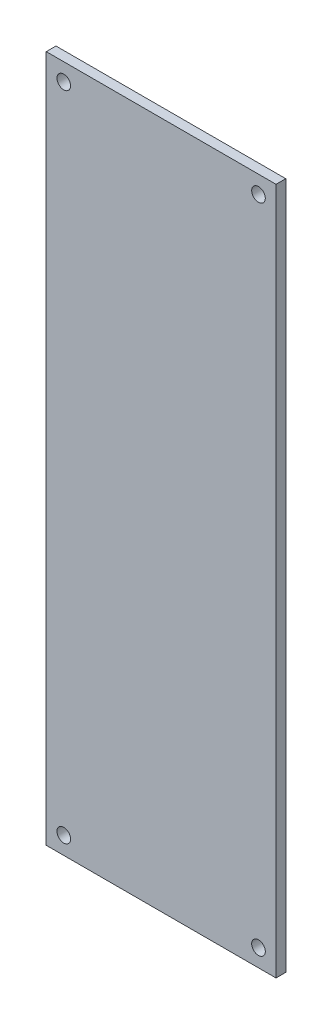
ISO-10303-21;
HEADER;
FILE_DESCRIPTION(('STEP AP214'),'2;1');
FILE_NAME('part.step','',(''),(''),'','','');
FILE_SCHEMA(('AUTOMOTIVE_DESIGN { 1 0 10303 214 1 1 1 1 }'));
ENDSEC;
DATA;
#1=APPLICATION_CONTEXT('core data for automotive mechanical design processes');
#2=APPLICATION_PROTOCOL_DEFINITION('international standard','automotive_design',2000,#1);
#3=PRODUCT_CONTEXT('',#1,'mechanical');
#4=PRODUCT('Part','Part','',(#3));
#5=PRODUCT_RELATED_PRODUCT_CATEGORY('part','',(#4));
#6=PRODUCT_DEFINITION_FORMATION('','',#4);
#7=PRODUCT_DEFINITION_CONTEXT('part definition',#1,'design');
#8=PRODUCT_DEFINITION('design','',#6,#7);
#9=PRODUCT_DEFINITION_SHAPE('','',#8);
#10=(LENGTH_UNIT() NAMED_UNIT(*) SI_UNIT(.MILLI.,.METRE.));
#11=(NAMED_UNIT(*) PLANE_ANGLE_UNIT() SI_UNIT($,.RADIAN.));
#12=(NAMED_UNIT(*) SI_UNIT($,.STERADIAN.) SOLID_ANGLE_UNIT());
#13=UNCERTAINTY_MEASURE_WITH_UNIT(LENGTH_MEASURE(1.E-05),#10,'distance_accuracy_value','');
#14=(GEOMETRIC_REPRESENTATION_CONTEXT(3) GLOBAL_UNCERTAINTY_ASSIGNED_CONTEXT((#13)) GLOBAL_UNIT_ASSIGNED_CONTEXT((#10,
#11,#12)) REPRESENTATION_CONTEXT('',''));
#15=CARTESIAN_POINT('',(0.,0.,0.));
#16=DIRECTION('',(0.,0.,1.));
#17=DIRECTION('',(1.,0.,0.));
#18=AXIS2_PLACEMENT_3D('',#15,#16,#17);
#19=CARTESIAN_POINT('',(59.,-176.5,5.));
#20=DIRECTION('',(-1.,0.,0.));
#21=DIRECTION('',(0.,0.,1.));
#22=AXIS2_PLACEMENT_3D('',#19,#20,#21);
#23=PLANE('',#22);
#24=DIRECTION('',(0.,1.,0.));
#25=VECTOR('',#24,1.);
#26=CARTESIAN_POINT('',(59.,-176.5,0.));
#27=LINE('',#26,#25);
#28=CARTESIAN_POINT('',(59.,-176.5,0.));
#29=VERTEX_POINT('',#28);
#30=CARTESIAN_POINT('',(59.,176.5,0.));
#31=VERTEX_POINT('',#30);
#32=EDGE_CURVE('E102',#29,#31,#27,.T.);
#33=ORIENTED_EDGE('',*,*,#32,.T.);
#34=DIRECTION('',(0.,0.,-1.));
#35=VECTOR('',#34,1.);
#36=CARTESIAN_POINT('',(59.,176.5,5.));
#37=LINE('',#36,#35);
#38=CARTESIAN_POINT('',(59.,176.5,5.));
#39=VERTEX_POINT('',#38);
#40=EDGE_CURVE('E11',#39,#31,#37,.T.);
#41=ORIENTED_EDGE('',*,*,#40,.F.);
#42=DIRECTION('',(0.,1.,0.));
#43=VECTOR('',#42,1.);
#44=CARTESIAN_POINT('',(59.,-176.5,5.));
#45=LINE('',#44,#43);
#46=CARTESIAN_POINT('',(59.,-176.5,5.));
#47=VERTEX_POINT('',#46);
#48=EDGE_CURVE('E90',#47,#39,#45,.T.);
#49=ORIENTED_EDGE('',*,*,#48,.F.);
#50=DIRECTION('',(0.,0.,-1.));
#51=VECTOR('',#50,1.);
#52=CARTESIAN_POINT('',(59.,-176.5,5.));
#53=LINE('',#52,#51);
#54=EDGE_CURVE('E98',#47,#29,#53,.T.);
#55=ORIENTED_EDGE('',*,*,#54,.T.);
#56=EDGE_LOOP('',(#33,#41,#49,#55));
#57=FACE_BOUND('',#56,.T.);
#58=ADVANCED_FACE('F39',(#57),#23,.F.);
#59=CARTESIAN_POINT('',(-59.,176.5,5.));
#60=DIRECTION('',(0.,-1.,0.));
#61=DIRECTION('',(0.,0.,-1.));
#62=AXIS2_PLACEMENT_3D('',#59,#60,#61);
#63=PLANE('',#62);
#64=DIRECTION('',(-1.,0.,0.));
#65=VECTOR('',#64,1.);
#66=CARTESIAN_POINT('',(-59.,176.5,0.));
#67=LINE('',#66,#65);
#68=CARTESIAN_POINT('',(-59.,176.5,0.));
#69=VERTEX_POINT('',#68);
#70=EDGE_CURVE('E94',#31,#69,#67,.T.);
#71=ORIENTED_EDGE('',*,*,#70,.T.);
#72=DIRECTION('',(0.,0.,-1.));
#73=VECTOR('',#72,1.);
#74=CARTESIAN_POINT('',(-59.,176.5,5.));
#75=LINE('',#74,#73);
#76=CARTESIAN_POINT('',(-59.,176.5,5.));
#77=VERTEX_POINT('',#76);
#78=EDGE_CURVE('E47',#77,#69,#75,.T.);
#79=ORIENTED_EDGE('',*,*,#78,.F.);
#80=DIRECTION('',(-1.,0.,0.));
#81=VECTOR('',#80,1.);
#82=CARTESIAN_POINT('',(-59.,176.5,5.));
#83=LINE('',#82,#81);
#84=EDGE_CURVE('E85',#39,#77,#83,.T.);
#85=ORIENTED_EDGE('',*,*,#84,.F.);
#86=ORIENTED_EDGE('',*,*,#40,.T.);
#87=EDGE_LOOP('',(#71,#79,#85,#86));
#88=FACE_BOUND('',#87,.T.);
#89=ADVANCED_FACE('F93',(#88),#63,.F.);
#90=CARTESIAN_POINT('',(-59.,-176.5,5.));
#91=DIRECTION('',(1.,0.,0.));
#92=DIRECTION('',(0.,0.,-1.));
#93=AXIS2_PLACEMENT_3D('',#90,#91,#92);
#94=PLANE('',#93);
#95=DIRECTION('',(0.,-1.,0.));
#96=VECTOR('',#95,1.);
#97=CARTESIAN_POINT('',(-59.,-176.5,0.));
#98=LINE('',#97,#96);
#99=CARTESIAN_POINT('',(-59.,-176.5,0.));
#100=VERTEX_POINT('',#99);
#101=EDGE_CURVE('E72',#69,#100,#98,.T.);
#102=ORIENTED_EDGE('',*,*,#101,.T.);
#103=DIRECTION('',(0.,0.,-1.));
#104=VECTOR('',#103,1.);
#105=CARTESIAN_POINT('',(-59.,-176.5,5.));
#106=LINE('',#105,#104);
#107=CARTESIAN_POINT('',(-59.,-176.5,5.));
#108=VERTEX_POINT('',#107);
#109=EDGE_CURVE('E95',#108,#100,#106,.T.);
#110=ORIENTED_EDGE('',*,*,#109,.F.);
#111=DIRECTION('',(0.,-1.,0.));
#112=VECTOR('',#111,1.);
#113=CARTESIAN_POINT('',(-59.,-176.5,5.));
#114=LINE('',#113,#112);
#115=EDGE_CURVE('E88',#77,#108,#114,.T.);
#116=ORIENTED_EDGE('',*,*,#115,.F.);
#117=ORIENTED_EDGE('',*,*,#78,.T.);
#118=EDGE_LOOP('',(#102,#110,#116,#117));
#119=FACE_BOUND('',#118,.T.);
#120=ADVANCED_FACE('F96',(#119),#94,.F.);
#121=CARTESIAN_POINT('',(-59.,-176.5,5.));
#122=DIRECTION('',(0.,1.,0.));
#123=DIRECTION('',(0.,0.,1.));
#124=AXIS2_PLACEMENT_3D('',#121,#122,#123);
#125=PLANE('',#124);
#126=DIRECTION('',(1.,0.,0.));
#127=VECTOR('',#126,1.);
#128=CARTESIAN_POINT('',(-59.,-176.5,0.));
#129=LINE('',#128,#127);
#130=EDGE_CURVE('E78',#100,#29,#129,.T.);
#131=ORIENTED_EDGE('',*,*,#130,.T.);
#132=ORIENTED_EDGE('',*,*,#54,.F.);
#133=DIRECTION('',(1.,0.,0.));
#134=VECTOR('',#133,1.);
#135=CARTESIAN_POINT('',(-59.,-176.5,5.));
#136=LINE('',#135,#134);
#137=EDGE_CURVE('E55',#108,#47,#136,.T.);
#138=ORIENTED_EDGE('',*,*,#137,.F.);
#139=ORIENTED_EDGE('',*,*,#109,.T.);
#140=EDGE_LOOP('',(#131,#132,#138,#139));
#141=FACE_BOUND('',#140,.T.);
#142=ADVANCED_FACE('F110',(#141),#125,.F.);
#143=CARTESIAN_POINT('',(0.,0.,5.));
#144=DIRECTION('',(0.,0.,-1.));
#145=DIRECTION('',(-1.,0.,0.));
#146=AXIS2_PLACEMENT_3D('',#143,#144,#145);
#147=PLANE('',#146);
#148=CARTESIAN_POINT('',(-50.,-167.5,5.));
#149=DIRECTION('',(0.,0.,1.));
#150=DIRECTION('',(-1.,0.,0.));
#151=AXIS2_PLACEMENT_3D('',#148,#149,#150);
#152=CIRCLE('',#151,3.5);
#153=CARTESIAN_POINT('',(-53.5,-167.5,5.));
#154=VERTEX_POINT('',#153);
#155=EDGE_CURVE('E122',#154,#154,#152,.T.);
#156=ORIENTED_EDGE('',*,*,#155,.F.);
#157=EDGE_LOOP('',(#156));
#158=FACE_BOUND('',#157,.T.);
#159=CARTESIAN_POINT('',(50.,-167.5,5.));
#160=DIRECTION('',(0.,0.,1.));
#161=DIRECTION('',(1.,0.,0.));
#162=AXIS2_PLACEMENT_3D('',#159,#160,#161);
#163=CIRCLE('',#162,3.5);
#164=CARTESIAN_POINT('',(53.5,-167.5,5.));
#165=VERTEX_POINT('',#164);
#166=EDGE_CURVE('E129',#165,#165,#163,.T.);
#167=ORIENTED_EDGE('',*,*,#166,.F.);
#168=EDGE_LOOP('',(#167));
#169=FACE_BOUND('',#168,.T.);
#170=CARTESIAN_POINT('',(50.,167.5,5.));
#171=DIRECTION('',(0.,0.,1.));
#172=DIRECTION('',(-1.,0.,0.));
#173=AXIS2_PLACEMENT_3D('',#170,#171,#172);
#174=CIRCLE('',#173,3.5);
#175=CARTESIAN_POINT('',(46.5,167.5,5.));
#176=VERTEX_POINT('',#175);
#177=EDGE_CURVE('E121',#176,#176,#174,.T.);
#178=ORIENTED_EDGE('',*,*,#177,.F.);
#179=EDGE_LOOP('',(#178));
#180=FACE_BOUND('',#179,.T.);
#181=CARTESIAN_POINT('',(-50.,167.5,5.));
#182=DIRECTION('',(0.,0.,1.));
#183=DIRECTION('',(1.,0.,0.));
#184=AXIS2_PLACEMENT_3D('',#181,#182,#183);
#185=CIRCLE('',#184,3.5);
#186=CARTESIAN_POINT('',(-46.5,167.5,5.));
#187=VERTEX_POINT('',#186);
#188=EDGE_CURVE('E118',#187,#187,#185,.T.);
#189=ORIENTED_EDGE('',*,*,#188,.F.);
#190=EDGE_LOOP('',(#189));
#191=FACE_BOUND('',#190,.T.);
#192=ORIENTED_EDGE('',*,*,#48,.T.);
#193=ORIENTED_EDGE('',*,*,#84,.T.);
#194=ORIENTED_EDGE('',*,*,#115,.T.);
#195=ORIENTED_EDGE('',*,*,#137,.T.);
#196=EDGE_LOOP('',(#192,#193,#194,#195));
#197=FACE_BOUND('',#196,.T.);
#198=ADVANCED_FACE('F86',(#158,#169,#180,#191,#197),#147,.F.);
#199=CARTESIAN_POINT('',(0.,0.,0.));
#200=DIRECTION('',(0.,0.,-1.));
#201=DIRECTION('',(-1.,0.,0.));
#202=AXIS2_PLACEMENT_3D('',#199,#200,#201);
#203=PLANE('',#202);
#204=CARTESIAN_POINT('',(-50.,-167.5,0.));
#205=DIRECTION('',(0.,0.,-1.));
#206=DIRECTION('',(-1.,0.,0.));
#207=AXIS2_PLACEMENT_3D('',#204,#205,#206);
#208=CIRCLE('',#207,3.5);
#209=CARTESIAN_POINT('',(-53.5,-167.5,0.));
#210=VERTEX_POINT('',#209);
#211=EDGE_CURVE('E126',#210,#210,#208,.F.);
#212=ORIENTED_EDGE('',*,*,#211,.T.);
#213=EDGE_LOOP('',(#212));
#214=FACE_BOUND('',#213,.T.);
#215=CARTESIAN_POINT('',(50.,-167.5,0.));
#216=DIRECTION('',(0.,0.,-1.));
#217=DIRECTION('',(-1.,0.,0.));
#218=AXIS2_PLACEMENT_3D('',#215,#216,#217);
#219=CIRCLE('',#218,3.5);
#220=CARTESIAN_POINT('',(46.5,-167.5,0.));
#221=VERTEX_POINT('',#220);
#222=EDGE_CURVE('E125',#221,#221,#219,.F.);
#223=ORIENTED_EDGE('',*,*,#222,.T.);
#224=EDGE_LOOP('',(#223));
#225=FACE_BOUND('',#224,.T.);
#226=CARTESIAN_POINT('',(50.,167.5,0.));
#227=DIRECTION('',(0.,0.,-1.));
#228=DIRECTION('',(-1.,0.,0.));
#229=AXIS2_PLACEMENT_3D('',#226,#227,#228);
#230=CIRCLE('',#229,3.5);
#231=CARTESIAN_POINT('',(46.5,167.5,0.));
#232=VERTEX_POINT('',#231);
#233=EDGE_CURVE('E132',#232,#232,#230,.F.);
#234=ORIENTED_EDGE('',*,*,#233,.T.);
#235=EDGE_LOOP('',(#234));
#236=FACE_BOUND('',#235,.T.);
#237=CARTESIAN_POINT('',(-50.,167.5,0.));
#238=DIRECTION('',(0.,0.,-1.));
#239=DIRECTION('',(-1.,0.,0.));
#240=AXIS2_PLACEMENT_3D('',#237,#238,#239);
#241=CIRCLE('',#240,3.5);
#242=CARTESIAN_POINT('',(-53.5,167.5,0.));
#243=VERTEX_POINT('',#242);
#244=EDGE_CURVE('E105',#243,#243,#241,.F.);
#245=ORIENTED_EDGE('',*,*,#244,.T.);
#246=EDGE_LOOP('',(#245));
#247=FACE_BOUND('',#246,.T.);
#248=ORIENTED_EDGE('',*,*,#32,.F.);
#249=ORIENTED_EDGE('',*,*,#130,.F.);
#250=ORIENTED_EDGE('',*,*,#101,.F.);
#251=ORIENTED_EDGE('',*,*,#70,.F.);
#252=EDGE_LOOP('',(#248,#249,#250,#251));
#253=FACE_BOUND('',#252,.T.);
#254=ADVANCED_FACE('F113',(#214,#225,#236,#247,#253),#203,.T.);
#255=CARTESIAN_POINT('',(-50.,167.5,-9.89949493661167));
#256=DIRECTION('',(0.,0.,1.));
#257=DIRECTION('',(1.,0.,0.));
#258=AXIS2_PLACEMENT_3D('',#255,#256,#257);
#259=CYLINDRICAL_SURFACE('',#258,3.5);
#260=ORIENTED_EDGE('',*,*,#188,.T.);
#261=EDGE_LOOP('',(#260));
#262=FACE_BOUND('',#261,.T.);
#263=ORIENTED_EDGE('',*,*,#244,.F.);
#264=EDGE_LOOP('',(#263));
#265=FACE_BOUND('',#264,.T.);
#266=ADVANCED_FACE('F145',(#262,#265),#259,.F.);
#267=CARTESIAN_POINT('',(50.,167.5,-9.89949493661167));
#268=DIRECTION('',(0.,0.,1.));
#269=DIRECTION('',(1.,0.,0.));
#270=AXIS2_PLACEMENT_3D('',#267,#268,#269);
#271=CYLINDRICAL_SURFACE('',#270,3.5);
#272=ORIENTED_EDGE('',*,*,#177,.T.);
#273=EDGE_LOOP('',(#272));
#274=FACE_BOUND('',#273,.T.);
#275=ORIENTED_EDGE('',*,*,#233,.F.);
#276=EDGE_LOOP('',(#275));
#277=FACE_BOUND('',#276,.T.);
#278=ADVANCED_FACE('F142',(#274,#277),#271,.F.);
#279=CARTESIAN_POINT('',(50.,-167.5,-9.89949493661167));
#280=DIRECTION('',(0.,0.,1.));
#281=DIRECTION('',(1.,0.,0.));
#282=AXIS2_PLACEMENT_3D('',#279,#280,#281);
#283=CYLINDRICAL_SURFACE('',#282,3.5);
#284=ORIENTED_EDGE('',*,*,#166,.T.);
#285=EDGE_LOOP('',(#284));
#286=FACE_BOUND('',#285,.T.);
#287=ORIENTED_EDGE('',*,*,#222,.F.);
#288=EDGE_LOOP('',(#287));
#289=FACE_BOUND('',#288,.T.);
#290=ADVANCED_FACE('F144',(#286,#289),#283,.F.);
#291=CARTESIAN_POINT('',(-50.,-167.5,-9.89949493661167));
#292=DIRECTION('',(0.,0.,1.));
#293=DIRECTION('',(1.,0.,0.));
#294=AXIS2_PLACEMENT_3D('',#291,#292,#293);
#295=CYLINDRICAL_SURFACE('',#294,3.5);
#296=ORIENTED_EDGE('',*,*,#155,.T.);
#297=EDGE_LOOP('',(#296));
#298=FACE_BOUND('',#297,.T.);
#299=ORIENTED_EDGE('',*,*,#211,.F.);
#300=EDGE_LOOP('',(#299));
#301=FACE_BOUND('',#300,.T.);
#302=ADVANCED_FACE('F152',(#298,#301),#295,.F.);
#303=CLOSED_SHELL('',(#58,#89,#120,#142,#198,#254,#266,#278,#290,#302));
#304=MANIFOLD_SOLID_BREP('B2',#303);
#305=ADVANCED_BREP_SHAPE_REPRESENTATION('',(#18,#304),#14);
#306=SHAPE_DEFINITION_REPRESENTATION(#9,#305);
ENDSEC;
END-ISO-10303-21;
